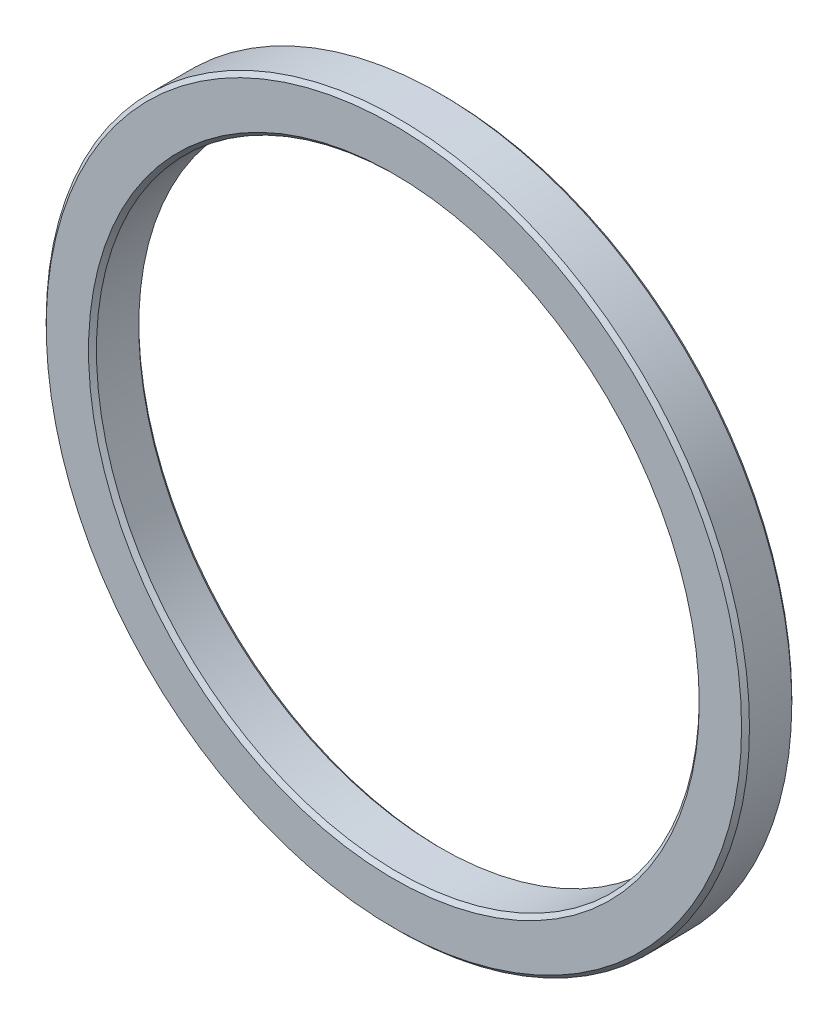
ISO-10303-21;
HEADER;
FILE_DESCRIPTION(('STEP AP214'),'2;1');
FILE_NAME('part.step','',(''),(''),'','','');
FILE_SCHEMA(('AUTOMOTIVE_DESIGN { 1 0 10303 214 1 1 1 1 }'));
ENDSEC;
DATA;
#1=APPLICATION_CONTEXT('core data for automotive mechanical design processes');
#2=APPLICATION_PROTOCOL_DEFINITION('international standard','automotive_design',2000,#1);
#3=PRODUCT_CONTEXT('',#1,'mechanical');
#4=PRODUCT('Part','Part','',(#3));
#5=PRODUCT_RELATED_PRODUCT_CATEGORY('part','',(#4));
#6=PRODUCT_DEFINITION_FORMATION('','',#4);
#7=PRODUCT_DEFINITION_CONTEXT('part definition',#1,'design');
#8=PRODUCT_DEFINITION('design','',#6,#7);
#9=PRODUCT_DEFINITION_SHAPE('','',#8);
#10=(LENGTH_UNIT() NAMED_UNIT(*) SI_UNIT(.MILLI.,.METRE.));
#11=(NAMED_UNIT(*) PLANE_ANGLE_UNIT() SI_UNIT($,.RADIAN.));
#12=(NAMED_UNIT(*) SI_UNIT($,.STERADIAN.) SOLID_ANGLE_UNIT());
#13=UNCERTAINTY_MEASURE_WITH_UNIT(LENGTH_MEASURE(1.E-05),#10,'distance_accuracy_value','');
#14=(GEOMETRIC_REPRESENTATION_CONTEXT(3) GLOBAL_UNCERTAINTY_ASSIGNED_CONTEXT((#13)) GLOBAL_UNIT_ASSIGNED_CONTEXT((#10,
#11,#12)) REPRESENTATION_CONTEXT('',''));
#15=CARTESIAN_POINT('',(0.,0.,0.));
#16=DIRECTION('',(0.,0.,1.));
#17=DIRECTION('',(1.,0.,0.));
#18=AXIS2_PLACEMENT_3D('',#15,#16,#17);
#19=CARTESIAN_POINT('',(0.,0.,6.35));
#20=DIRECTION('',(0.,0.,1.));
#21=DIRECTION('',(1.,0.,0.));
#22=AXIS2_PLACEMENT_3D('',#19,#20,#21);
#23=PLANE('',#22);
#24=CARTESIAN_POINT('',(0.,0.,6.35));
#25=DIRECTION('',(0.,0.,1.));
#26=DIRECTION('',(1.,0.,0.));
#27=AXIS2_PLACEMENT_3D('',#24,#25,#26);
#28=CIRCLE('',#27,38.6);
#29=CARTESIAN_POINT('',(38.6,0.,6.35));
#30=VERTEX_POINT('',#29);
#31=EDGE_CURVE('E10',#30,#30,#28,.F.);
#32=ORIENTED_EDGE('',*,*,#31,.T.);
#33=EDGE_LOOP('',(#32));
#34=FACE_BOUND('',#33,.T.);
#35=CARTESIAN_POINT('',(0.,0.,6.35));
#36=DIRECTION('',(0.,0.,1.));
#37=DIRECTION('',(1.,0.,0.));
#38=AXIS2_PLACEMENT_3D('',#35,#36,#37);
#39=CIRCLE('',#38,43.95);
#40=CARTESIAN_POINT('',(43.95,0.,6.35));
#41=VERTEX_POINT('',#40);
#42=EDGE_CURVE('E41',#41,#41,#39,.T.);
#43=ORIENTED_EDGE('',*,*,#42,.T.);
#44=EDGE_LOOP('',(#43));
#45=FACE_BOUND('',#44,.T.);
#46=ADVANCED_FACE('F34',(#34,#45),#23,.T.);
#47=CARTESIAN_POINT('',(0.,0.,0.));
#48=DIRECTION('',(0.,0.,1.));
#49=DIRECTION('',(1.,0.,0.));
#50=AXIS2_PLACEMENT_3D('',#47,#48,#49);
#51=PLANE('',#50);
#52=CARTESIAN_POINT('',(0.,0.,0.));
#53=DIRECTION('',(0.,0.,1.));
#54=DIRECTION('',(1.,0.,0.));
#55=AXIS2_PLACEMENT_3D('',#52,#53,#54);
#56=CIRCLE('',#55,38.6);
#57=CARTESIAN_POINT('',(38.6,0.,0.));
#58=VERTEX_POINT('',#57);
#59=EDGE_CURVE('E60',#58,#58,#56,.T.);
#60=ORIENTED_EDGE('',*,*,#59,.T.);
#61=EDGE_LOOP('',(#60));
#62=FACE_BOUND('',#61,.T.);
#63=CARTESIAN_POINT('',(0.,0.,0.));
#64=DIRECTION('',(0.,0.,1.));
#65=DIRECTION('',(1.,0.,0.));
#66=AXIS2_PLACEMENT_3D('',#63,#64,#65);
#67=CIRCLE('',#66,43.95);
#68=CARTESIAN_POINT('',(43.95,0.,0.));
#69=VERTEX_POINT('',#68);
#70=EDGE_CURVE('E63',#69,#69,#67,.F.);
#71=ORIENTED_EDGE('',*,*,#70,.T.);
#72=EDGE_LOOP('',(#71));
#73=FACE_BOUND('',#72,.T.);
#74=ADVANCED_FACE('F67',(#62,#73),#51,.F.);
#75=CARTESIAN_POINT('',(0.,0.,6.35));
#76=DIRECTION('',(0.,0.,-1.));
#77=DIRECTION('',(-1.,0.,0.));
#78=AXIS2_PLACEMENT_3D('',#75,#76,#77);
#79=CYLINDRICAL_SURFACE('',#78,44.45);
#80=CARTESIAN_POINT('',(0.,0.,0.499999999999987));
#81=DIRECTION('',(0.,0.,1.));
#82=DIRECTION('',(1.,0.,0.));
#83=AXIS2_PLACEMENT_3D('',#80,#81,#82);
#84=CIRCLE('',#83,44.45);
#85=CARTESIAN_POINT('',(44.45,0.,0.499999999999987));
#86=VERTEX_POINT('',#85);
#87=EDGE_CURVE('E45',#86,#86,#84,.T.);
#88=ORIENTED_EDGE('',*,*,#87,.T.);
#89=EDGE_LOOP('',(#88));
#90=FACE_BOUND('',#89,.T.);
#91=CARTESIAN_POINT('',(0.,0.,5.85));
#92=DIRECTION('',(0.,0.,1.));
#93=DIRECTION('',(1.,0.,0.));
#94=AXIS2_PLACEMENT_3D('',#91,#92,#93);
#95=CIRCLE('',#94,44.45);
#96=CARTESIAN_POINT('',(44.45,0.,5.85));
#97=VERTEX_POINT('',#96);
#98=EDGE_CURVE('E49',#97,#97,#95,.F.);
#99=ORIENTED_EDGE('',*,*,#98,.T.);
#100=EDGE_LOOP('',(#99));
#101=FACE_BOUND('',#100,.T.);
#102=ADVANCED_FACE('F77',(#90,#101),#79,.T.);
#103=CARTESIAN_POINT('',(0.,0.,6.35));
#104=DIRECTION('',(0.,0.,-1.));
#105=DIRECTION('',(-1.,0.,0.));
#106=AXIS2_PLACEMENT_3D('',#103,#104,#105);
#107=CYLINDRICAL_SURFACE('',#106,38.1);
#108=CARTESIAN_POINT('',(0.,0.,0.499999999999994));
#109=DIRECTION('',(0.,0.,1.));
#110=DIRECTION('',(1.,0.,0.));
#111=AXIS2_PLACEMENT_3D('',#108,#109,#110);
#112=CIRCLE('',#111,38.1);
#113=CARTESIAN_POINT('',(38.1,0.,0.499999999999994));
#114=VERTEX_POINT('',#113);
#115=EDGE_CURVE('E54',#114,#114,#112,.F.);
#116=ORIENTED_EDGE('',*,*,#115,.T.);
#117=EDGE_LOOP('',(#116));
#118=FACE_BOUND('',#117,.T.);
#119=CARTESIAN_POINT('',(0.,0.,5.84999999999998));
#120=DIRECTION('',(0.,0.,1.));
#121=DIRECTION('',(1.,0.,0.));
#122=AXIS2_PLACEMENT_3D('',#119,#120,#121);
#123=CIRCLE('',#122,38.1);
#124=CARTESIAN_POINT('',(38.1,0.,5.84999999999998));
#125=VERTEX_POINT('',#124);
#126=EDGE_CURVE('E57',#125,#125,#123,.T.);
#127=ORIENTED_EDGE('',*,*,#126,.T.);
#128=EDGE_LOOP('',(#127));
#129=FACE_BOUND('',#128,.T.);
#130=ADVANCED_FACE('F80',(#118,#129),#107,.F.);
#131=CARTESIAN_POINT('',(0.,0.,0.));
#132=DIRECTION('',(0.,0.,-1.));
#133=DIRECTION('',(-1.,0.,0.));
#134=AXIS2_PLACEMENT_3D('',#131,#132,#133);
#135=CONICAL_SURFACE('',#134,38.6,0.785398163397462);
#136=ORIENTED_EDGE('',*,*,#115,.F.);
#137=EDGE_LOOP('',(#136));
#138=FACE_BOUND('',#137,.T.);
#139=ORIENTED_EDGE('',*,*,#59,.F.);
#140=EDGE_LOOP('',(#139));
#141=FACE_BOUND('',#140,.T.);
#142=ADVANCED_FACE('F73',(#138,#141),#135,.F.);
#143=CARTESIAN_POINT('',(0.,0.,0.499999999999987));
#144=DIRECTION('',(0.,0.,1.));
#145=DIRECTION('',(1.,0.,0.));
#146=AXIS2_PLACEMENT_3D('',#143,#144,#145);
#147=CONICAL_SURFACE('',#146,44.45,0.785398163397455);
#148=ORIENTED_EDGE('',*,*,#70,.F.);
#149=EDGE_LOOP('',(#148));
#150=FACE_BOUND('',#149,.T.);
#151=ORIENTED_EDGE('',*,*,#87,.F.);
#152=EDGE_LOOP('',(#151));
#153=FACE_BOUND('',#152,.T.);
#154=ADVANCED_FACE('F69',(#150,#153),#147,.T.);
#155=CARTESIAN_POINT('',(0.,0.,5.84999999999998));
#156=DIRECTION('',(0.,0.,1.));
#157=DIRECTION('',(1.,0.,0.));
#158=AXIS2_PLACEMENT_3D('',#155,#156,#157);
#159=CONICAL_SURFACE('',#158,38.1,0.785398163397462);
#160=ORIENTED_EDGE('',*,*,#31,.F.);
#161=EDGE_LOOP('',(#160));
#162=FACE_BOUND('',#161,.T.);
#163=ORIENTED_EDGE('',*,*,#126,.F.);
#164=EDGE_LOOP('',(#163));
#165=FACE_BOUND('',#164,.T.);
#166=ADVANCED_FACE('F72',(#162,#165),#159,.F.);
#167=CARTESIAN_POINT('',(0.,0.,6.35));
#168=DIRECTION('',(0.,0.,-1.));
#169=DIRECTION('',(-1.,0.,0.));
#170=AXIS2_PLACEMENT_3D('',#167,#168,#169);
#171=CONICAL_SURFACE('',#170,43.95,0.785398163397476);
#172=ORIENTED_EDGE('',*,*,#98,.F.);
#173=EDGE_LOOP('',(#172));
#174=FACE_BOUND('',#173,.T.);
#175=ORIENTED_EDGE('',*,*,#42,.F.);
#176=EDGE_LOOP('',(#175));
#177=FACE_BOUND('',#176,.T.);
#178=ADVANCED_FACE('F36',(#174,#177),#171,.T.);
#179=CLOSED_SHELL('',(#46,#74,#102,#130,#142,#154,#166,#178));
#180=MANIFOLD_SOLID_BREP('B2',#179);
#181=ADVANCED_BREP_SHAPE_REPRESENTATION('',(#18,#180),#14);
#182=SHAPE_DEFINITION_REPRESENTATION(#9,#181);
ENDSEC;
END-ISO-10303-21;
